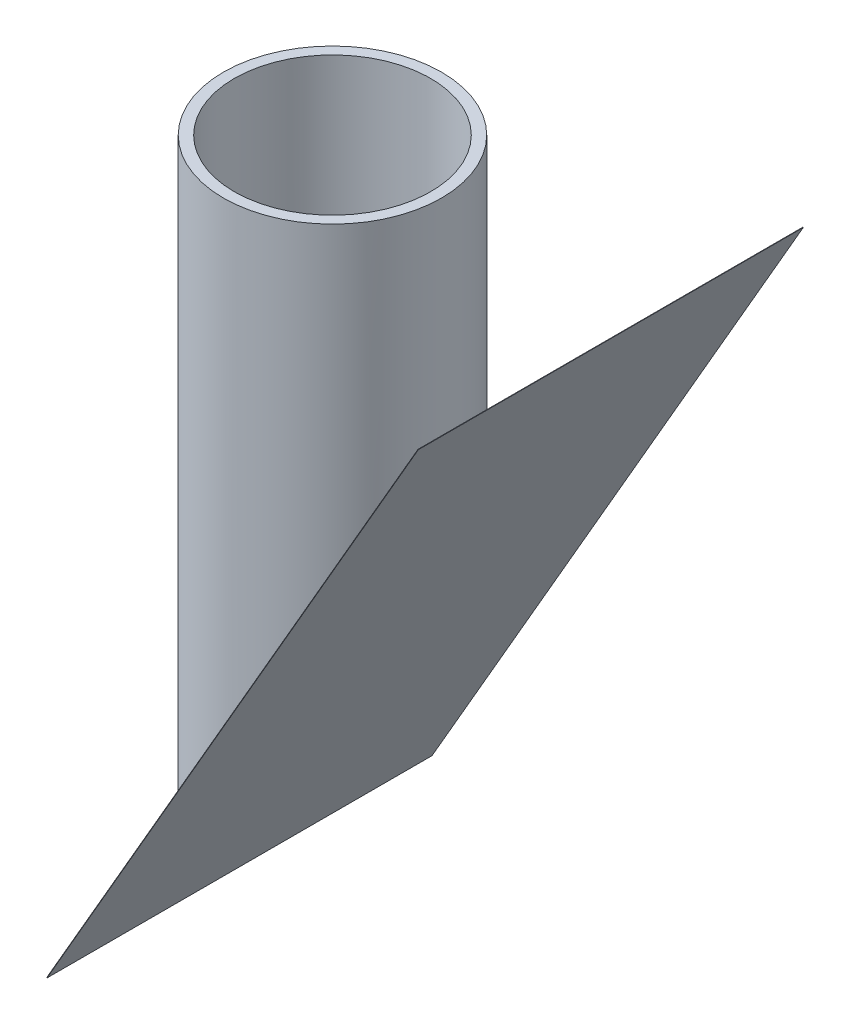
ISO-10303-21;
HEADER;
FILE_DESCRIPTION(('STEP AP214'),'2;1');
FILE_NAME('part.step','',(''),(''),'','','');
FILE_SCHEMA(('AUTOMOTIVE_DESIGN { 1 0 10303 214 1 1 1 1 }'));
ENDSEC;
DATA;
#1=APPLICATION_CONTEXT('core data for automotive mechanical design processes');
#2=APPLICATION_PROTOCOL_DEFINITION('international standard','automotive_design',2000,#1);
#3=PRODUCT_CONTEXT('',#1,'mechanical');
#4=PRODUCT('Part','Part','',(#3));
#5=PRODUCT_RELATED_PRODUCT_CATEGORY('part','',(#4));
#6=PRODUCT_DEFINITION_FORMATION('','',#4);
#7=PRODUCT_DEFINITION_CONTEXT('part definition',#1,'design');
#8=PRODUCT_DEFINITION('design','',#6,#7);
#9=PRODUCT_DEFINITION_SHAPE('','',#8);
#10=(LENGTH_UNIT() NAMED_UNIT(*) SI_UNIT(.MILLI.,.METRE.));
#11=(NAMED_UNIT(*) PLANE_ANGLE_UNIT() SI_UNIT($,.RADIAN.));
#12=(NAMED_UNIT(*) SI_UNIT($,.STERADIAN.) SOLID_ANGLE_UNIT());
#13=UNCERTAINTY_MEASURE_WITH_UNIT(LENGTH_MEASURE(1.E-05),#10,'distance_accuracy_value','');
#14=(GEOMETRIC_REPRESENTATION_CONTEXT(3) GLOBAL_UNCERTAINTY_ASSIGNED_CONTEXT((#13)) GLOBAL_UNIT_ASSIGNED_CONTEXT((#10,
#11,#12)) REPRESENTATION_CONTEXT('',''));
#15=CARTESIAN_POINT('',(0.,0.,0.));
#16=DIRECTION('',(0.,0.,1.));
#17=DIRECTION('',(1.,0.,0.));
#18=AXIS2_PLACEMENT_3D('',#15,#16,#17);
#19=CARTESIAN_POINT('',(-31.7704471263826,-3.26650437500902,-59.1431925782918));
#20=DIRECTION('',(0.866025403784442,-0.499999999999995,0.));
#21=DIRECTION('',(0.499999999999995,0.866025403784442,0.));
#22=AXIS2_PLACEMENT_3D('',#19,#20,#21);
#23=PLANE('',#22);
#24=DIRECTION('',(0.,0.,-1.));
#25=VECTOR('',#24,1.);
#26=CARTESIAN_POINT('',(-31.7704471263826,-3.26650437500902,46.7449029159871));
#27=LINE('',#26,#25);
#28=CARTESIAN_POINT('',(-31.7704471263826,-3.26650437500902,46.7449029159871));
#29=VERTEX_POINT('',#28);
#30=CARTESIAN_POINT('',(-31.7704471263826,-3.26650437500902,-59.1431925782918));
#31=VERTEX_POINT('',#30);
#32=EDGE_CURVE('E41',#29,#31,#27,.T.);
#33=ORIENTED_EDGE('',*,*,#32,.T.);
#34=DIRECTION('',(0.499999999999995,0.866025403784442,0.));
#35=VECTOR('',#34,1.);
#36=CARTESIAN_POINT('',(-31.7704471263826,-3.26650437500902,-59.1431925782918));
#37=LINE('',#36,#35);
#38=CARTESIAN_POINT('',(70.3478981327309,173.607657998638,-59.1431925782918));
#39=VERTEX_POINT('',#38);
#40=EDGE_CURVE('E71',#31,#39,#37,.T.);
#41=ORIENTED_EDGE('',*,*,#40,.T.);
#42=DIRECTION('',(0.,0.,1.));
#43=VECTOR('',#42,1.);
#44=CARTESIAN_POINT('',(70.3478981327309,173.607657998638,46.7449029159871));
#45=LINE('',#44,#43);
#46=CARTESIAN_POINT('',(70.3478981327309,173.607657998638,46.7449029159871));
#47=VERTEX_POINT('',#46);
#48=EDGE_CURVE('E104',#39,#47,#45,.T.);
#49=ORIENTED_EDGE('',*,*,#48,.T.);
#50=DIRECTION('',(-0.499999999999995,-0.866025403784442,0.));
#51=VECTOR('',#50,1.);
#52=CARTESIAN_POINT('',(-31.7704471263826,-3.26650437500902,46.7449029159871));
#53=LINE('',#52,#51);
#54=EDGE_CURVE('E95',#47,#29,#53,.T.);
#55=ORIENTED_EDGE('',*,*,#54,.T.);
#56=EDGE_LOOP('',(#33,#41,#49,#55));
#57=FACE_BOUND('',#56,.T.);
#58=ADVANCED_FACE('F37',(#57),#23,.T.);
#59=CARTESIAN_POINT('',(-22.5000000000002,12.9903810567665,0.));
#60=DIRECTION('',(0.866025403784442,-0.499999999999995,0.));
#61=DIRECTION('',(0.499999999999995,0.866025403784442,0.));
#62=AXIS2_PLACEMENT_3D('',#59,#60,#61);
#63=PLANE('',#62);
#64=CARTESIAN_POINT('',(0.,51.9615242270671,0.));
#65=DIRECTION('',(0.866025403784442,-0.499999999999995,0.));
#66=DIRECTION('',(-0.499999999999995,-0.866025403784442,0.));
#67=AXIS2_PLACEMENT_3D('',#64,#65,#66);
#68=ELLIPSE('',#67,54.0000000000006,27.);
#69=CARTESIAN_POINT('',(-27.,5.19615242270675,0.));
#70=VERTEX_POINT('',#69);
#71=EDGE_CURVE('E110',#70,#70,#68,.T.);
#72=ORIENTED_EDGE('',*,*,#71,.F.);
#73=EDGE_LOOP('',(#72));
#74=FACE_BOUND('',#73,.T.);
#75=ADVANCED_FACE('F136',(#74),#63,.F.);
#76=CARTESIAN_POINT('',(0.,190.,0.));
#77=DIRECTION('',(0.,-1.,0.));
#78=DIRECTION('',(0.,0.,-1.));
#79=AXIS2_PLACEMENT_3D('',#76,#77,#78);
#80=CYLINDRICAL_SURFACE('',#79,27.);
#81=CARTESIAN_POINT('',(0.,190.,0.));
#82=DIRECTION('',(0.,1.,0.));
#83=DIRECTION('',(0.,0.,1.));
#84=AXIS2_PLACEMENT_3D('',#81,#82,#83);
#85=CIRCLE('',#84,27.);
#86=CARTESIAN_POINT('',(0.,190.,27.));
#87=VERTEX_POINT('',#86);
#88=EDGE_CURVE('E114',#87,#87,#85,.T.);
#89=ORIENTED_EDGE('',*,*,#88,.T.);
#90=EDGE_LOOP('',(#89));
#91=FACE_BOUND('',#90,.T.);
#92=ORIENTED_EDGE('',*,*,#71,.T.);
#93=EDGE_LOOP('',(#92));
#94=FACE_BOUND('',#93,.T.);
#95=ADVANCED_FACE('F145',(#91,#94),#80,.F.);
#96=CARTESIAN_POINT('',(0.,190.,0.));
#97=DIRECTION('',(0.,1.,0.));
#98=DIRECTION('',(0.,0.,1.));
#99=AXIS2_PLACEMENT_3D('',#96,#97,#98);
#100=PLANE('',#99);
#101=CARTESIAN_POINT('',(0.,190.,0.));
#102=DIRECTION('',(0.,1.,0.));
#103=DIRECTION('',(0.,0.,1.));
#104=AXIS2_PLACEMENT_3D('',#101,#102,#103);
#105=CIRCLE('',#104,30.);
#106=CARTESIAN_POINT('',(0.,190.,30.));
#107=VERTEX_POINT('',#106);
#108=EDGE_CURVE('E120',#107,#107,#105,.T.);
#109=ORIENTED_EDGE('',*,*,#108,.T.);
#110=EDGE_LOOP('',(#109));
#111=FACE_BOUND('',#110,.T.);
#112=ORIENTED_EDGE('',*,*,#88,.F.);
#113=EDGE_LOOP('',(#112));
#114=FACE_BOUND('',#113,.T.);
#115=ADVANCED_FACE('F126',(#111,#114),#100,.T.);
#116=CARTESIAN_POINT('',(0.,190.,0.));
#117=DIRECTION('',(0.,-1.,0.));
#118=DIRECTION('',(0.,0.,-1.));
#119=AXIS2_PLACEMENT_3D('',#116,#117,#118);
#120=CYLINDRICAL_SURFACE('',#119,30.);
#121=ORIENTED_EDGE('',*,*,#108,.F.);
#122=EDGE_LOOP('',(#121));
#123=FACE_BOUND('',#122,.T.);
#124=CARTESIAN_POINT('',(0.,51.9615242270671,0.));
#125=DIRECTION('',(0.866025403784442,-0.499999999999995,0.));
#126=DIRECTION('',(-0.499999999999995,-0.866025403784442,0.));
#127=AXIS2_PLACEMENT_3D('',#124,#125,#126);
#128=ELLIPSE('',#127,60.0000000000006,30.);
#129=CARTESIAN_POINT('',(-30.,0.,0.));
#130=VERTEX_POINT('',#129);
#131=EDGE_CURVE('E117',#130,#130,#128,.T.);
#132=ORIENTED_EDGE('',*,*,#131,.F.);
#133=EDGE_LOOP('',(#132));
#134=FACE_BOUND('',#133,.T.);
#135=ADVANCED_FACE('F39',(#123,#134),#120,.T.);
#136=CARTESIAN_POINT('',(-31.7704471263826,-3.26650437500902,-59.1431925782918));
#137=DIRECTION('',(0.,0.,1.));
#138=DIRECTION('',(1.,0.,0.));
#139=AXIS2_PLACEMENT_3D('',#136,#137,#138);
#140=PLANE('',#139);
#141=DIRECTION('',(0.499999999999995,0.866025403784442,0.));
#142=VECTOR('',#141,1.);
#143=CARTESIAN_POINT('',(-31.8570496667611,-3.21650437500902,-59.1431925782918));
#144=LINE('',#143,#142);
#145=CARTESIAN_POINT('',(-31.8570496667611,-3.21650437500902,-59.1431925782918));
#146=VERTEX_POINT('',#145);
#147=CARTESIAN_POINT('',(70.2612955923524,173.657657998638,-59.1431925782918));
#148=VERTEX_POINT('',#147);
#149=EDGE_CURVE('E47',#146,#148,#144,.T.);
#150=ORIENTED_EDGE('',*,*,#149,.T.);
#151=DIRECTION('',(-0.866025403784442,0.499999999999995,0.));
#152=VECTOR('',#151,1.);
#153=CARTESIAN_POINT('',(70.3478981327309,173.607657998638,-59.1431925782918));
#154=LINE('',#153,#152);
#155=EDGE_CURVE('E92',#39,#148,#154,.T.);
#156=ORIENTED_EDGE('',*,*,#155,.F.);
#157=ORIENTED_EDGE('',*,*,#40,.F.);
#158=DIRECTION('',(-0.866025403784442,0.499999999999995,0.));
#159=VECTOR('',#158,1.);
#160=CARTESIAN_POINT('',(-31.7704471263826,-3.26650437500902,-59.1431925782918));
#161=LINE('',#160,#159);
#162=EDGE_CURVE('E109',#31,#146,#161,.T.);
#163=ORIENTED_EDGE('',*,*,#162,.T.);
#164=EDGE_LOOP('',(#150,#156,#157,#163));
#165=FACE_BOUND('',#164,.T.);
#166=ADVANCED_FACE('F131',(#165),#140,.F.);
#167=CARTESIAN_POINT('',(70.3478981327309,173.607657998638,46.7449029159871));
#168=DIRECTION('',(-0.499999999999995,-0.866025403784442,0.));
#169=DIRECTION('',(0.866025403784442,-0.499999999999995,0.));
#170=AXIS2_PLACEMENT_3D('',#167,#168,#169);
#171=PLANE('',#170);
#172=DIRECTION('',(0.,0.,1.));
#173=VECTOR('',#172,1.);
#174=CARTESIAN_POINT('',(70.2612955923524,173.657657998638,46.7449029159871));
#175=LINE('',#174,#173);
#176=CARTESIAN_POINT('',(70.2612955923524,173.657657998638,46.7449029159871));
#177=VERTEX_POINT('',#176);
#178=EDGE_CURVE('E87',#148,#177,#175,.T.);
#179=ORIENTED_EDGE('',*,*,#178,.T.);
#180=DIRECTION('',(-0.866025403784442,0.499999999999995,0.));
#181=VECTOR('',#180,1.);
#182=CARTESIAN_POINT('',(70.3478981327309,173.607657998638,46.7449029159871));
#183=LINE('',#182,#181);
#184=EDGE_CURVE('E90',#47,#177,#183,.T.);
#185=ORIENTED_EDGE('',*,*,#184,.F.);
#186=ORIENTED_EDGE('',*,*,#48,.F.);
#187=ORIENTED_EDGE('',*,*,#155,.T.);
#188=EDGE_LOOP('',(#179,#185,#186,#187));
#189=FACE_BOUND('',#188,.T.);
#190=ADVANCED_FACE('F88',(#189),#171,.F.);
#191=CARTESIAN_POINT('',(-31.7704471263826,-3.26650437500902,46.7449029159871));
#192=DIRECTION('',(0.499999999999995,0.866025403784442,0.));
#193=DIRECTION('',(-0.866025403784442,0.499999999999995,0.));
#194=AXIS2_PLACEMENT_3D('',#191,#192,#193);
#195=PLANE('',#194);
#196=DIRECTION('',(0.,0.,-1.));
#197=VECTOR('',#196,1.);
#198=CARTESIAN_POINT('',(-31.8570496667611,-3.21650437500902,46.7449029159871));
#199=LINE('',#198,#197);
#200=CARTESIAN_POINT('',(-31.8570496667611,-3.21650437500902,46.7449029159871));
#201=VERTEX_POINT('',#200);
#202=EDGE_CURVE('E11',#201,#146,#199,.T.);
#203=ORIENTED_EDGE('',*,*,#202,.T.);
#204=ORIENTED_EDGE('',*,*,#162,.F.);
#205=ORIENTED_EDGE('',*,*,#32,.F.);
#206=DIRECTION('',(-0.866025403784442,0.499999999999995,0.));
#207=VECTOR('',#206,1.);
#208=CARTESIAN_POINT('',(-31.7704471263826,-3.26650437500902,46.7449029159871));
#209=LINE('',#208,#207);
#210=EDGE_CURVE('E96',#29,#201,#209,.T.);
#211=ORIENTED_EDGE('',*,*,#210,.T.);
#212=EDGE_LOOP('',(#203,#204,#205,#211));
#213=FACE_BOUND('',#212,.T.);
#214=ADVANCED_FACE('F108',(#213),#195,.F.);
#215=ORIENTED_EDGE('',*,*,#131,.T.);
#216=EDGE_LOOP('',(#215));
#217=FACE_BOUND('',#216,.T.);
#218=ORIENTED_EDGE('',*,*,#202,.F.);
#219=DIRECTION('',(-0.499999999999995,-0.866025403784442,0.));
#220=VECTOR('',#219,1.);
#221=CARTESIAN_POINT('',(-31.8570496667611,-3.21650437500902,46.7449029159871));
#222=LINE('',#221,#220);
#223=EDGE_CURVE('E81',#177,#201,#222,.T.);
#224=ORIENTED_EDGE('',*,*,#223,.F.);
#225=ORIENTED_EDGE('',*,*,#178,.F.);
#226=ORIENTED_EDGE('',*,*,#149,.F.);
#227=EDGE_LOOP('',(#218,#224,#225,#226));
#228=FACE_BOUND('',#227,.T.);
#229=ADVANCED_FACE('F98',(#217,#228),#63,.F.);
#230=CARTESIAN_POINT('',(-31.7704471263826,-3.26650437500902,46.7449029159871));
#231=DIRECTION('',(0.,0.,-1.));
#232=DIRECTION('',(-1.,0.,0.));
#233=AXIS2_PLACEMENT_3D('',#230,#231,#232);
#234=PLANE('',#233);
#235=ORIENTED_EDGE('',*,*,#223,.T.);
#236=ORIENTED_EDGE('',*,*,#210,.F.);
#237=ORIENTED_EDGE('',*,*,#54,.F.);
#238=ORIENTED_EDGE('',*,*,#184,.T.);
#239=EDGE_LOOP('',(#235,#236,#237,#238));
#240=FACE_BOUND('',#239,.T.);
#241=ADVANCED_FACE('F94',(#240),#234,.F.);
#242=CLOSED_SHELL('',(#58,#75,#95,#115,#135,#166,#190,#214,#229,#241));
#243=MANIFOLD_SOLID_BREP('B2',#242);
#244=ADVANCED_BREP_SHAPE_REPRESENTATION('',(#18,#243),#14);
#245=SHAPE_DEFINITION_REPRESENTATION(#9,#244);
ENDSEC;
END-ISO-10303-21;
